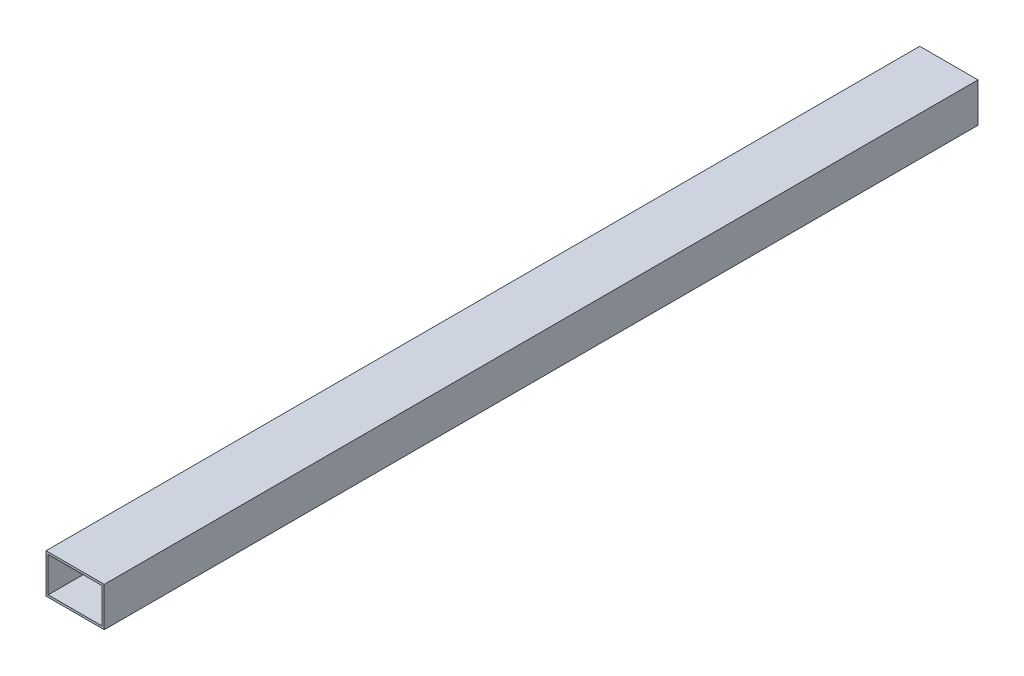
ISO-10303-21;
HEADER;
FILE_DESCRIPTION(('STEP AP214'),'2;1');
FILE_NAME('part.step','',(''),(''),'','','');
FILE_SCHEMA(('AUTOMOTIVE_DESIGN { 1 0 10303 214 1 1 1 1 }'));
ENDSEC;
DATA;
#1=APPLICATION_CONTEXT('core data for automotive mechanical design processes');
#2=APPLICATION_PROTOCOL_DEFINITION('international standard','automotive_design',2000,#1);
#3=PRODUCT_CONTEXT('',#1,'mechanical');
#4=PRODUCT('Part','Part','',(#3));
#5=PRODUCT_RELATED_PRODUCT_CATEGORY('part','',(#4));
#6=PRODUCT_DEFINITION_FORMATION('','',#4);
#7=PRODUCT_DEFINITION_CONTEXT('part definition',#1,'design');
#8=PRODUCT_DEFINITION('design','',#6,#7);
#9=PRODUCT_DEFINITION_SHAPE('','',#8);
#10=(LENGTH_UNIT() NAMED_UNIT(*) SI_UNIT(.MILLI.,.METRE.));
#11=(NAMED_UNIT(*) PLANE_ANGLE_UNIT() SI_UNIT($,.RADIAN.));
#12=(NAMED_UNIT(*) SI_UNIT($,.STERADIAN.) SOLID_ANGLE_UNIT());
#13=UNCERTAINTY_MEASURE_WITH_UNIT(LENGTH_MEASURE(1.E-05),#10,'distance_accuracy_value','');
#14=(GEOMETRIC_REPRESENTATION_CONTEXT(3) GLOBAL_UNCERTAINTY_ASSIGNED_CONTEXT((#13)) GLOBAL_UNIT_ASSIGNED_CONTEXT((#10,
#11,#12)) REPRESENTATION_CONTEXT('',''));
#15=CARTESIAN_POINT('',(0.,0.,0.));
#16=DIRECTION('',(0.,0.,1.));
#17=DIRECTION('',(1.,0.,0.));
#18=AXIS2_PLACEMENT_3D('',#15,#16,#17);
#19=CARTESIAN_POINT('',(0.,0.,600.));
#20=DIRECTION('',(0.,0.,-1.));
#21=DIRECTION('',(-1.,0.,0.));
#22=AXIS2_PLACEMENT_3D('',#19,#20,#21);
#23=PLANE('',#22);
#24=DIRECTION('',(0.,-1.,0.));
#25=VECTOR('',#24,1.);
#26=CARTESIAN_POINT('',(0.,0.,600.));
#27=LINE('',#26,#25);
#28=CARTESIAN_POINT('',(0.,27.,600.));
#29=VERTEX_POINT('',#28);
#30=CARTESIAN_POINT('',(0.,0.,600.));
#31=VERTEX_POINT('',#30);
#32=EDGE_CURVE('E134',#29,#31,#27,.T.);
#33=ORIENTED_EDGE('',*,*,#32,.T.);
#34=DIRECTION('',(1.,0.,0.));
#35=VECTOR('',#34,1.);
#36=CARTESIAN_POINT('',(0.,0.,600.));
#37=LINE('',#36,#35);
#38=CARTESIAN_POINT('',(40.,0.,600.));
#39=VERTEX_POINT('',#38);
#40=EDGE_CURVE('E137',#31,#39,#37,.T.);
#41=ORIENTED_EDGE('',*,*,#40,.T.);
#42=DIRECTION('',(0.,1.,0.));
#43=VECTOR('',#42,1.);
#44=CARTESIAN_POINT('',(40.,0.,600.));
#45=LINE('',#44,#43);
#46=CARTESIAN_POINT('',(40.,27.,600.));
#47=VERTEX_POINT('',#46);
#48=EDGE_CURVE('E140',#39,#47,#45,.T.);
#49=ORIENTED_EDGE('',*,*,#48,.T.);
#50=DIRECTION('',(-1.,0.,0.));
#51=VECTOR('',#50,1.);
#52=CARTESIAN_POINT('',(0.,27.,600.));
#53=LINE('',#52,#51);
#54=EDGE_CURVE('E142',#47,#29,#53,.T.);
#55=ORIENTED_EDGE('',*,*,#54,.T.);
#56=EDGE_LOOP('',(#33,#41,#49,#55));
#57=FACE_BOUND('',#56,.T.);
#58=DIRECTION('',(0.,-1.,0.));
#59=VECTOR('',#58,1.);
#60=CARTESIAN_POINT('',(1.5,25.5,600.));
#61=LINE('',#60,#59);
#62=CARTESIAN_POINT('',(1.5,25.5,600.));
#63=VERTEX_POINT('',#62);
#64=CARTESIAN_POINT('',(1.5,1.5,600.));
#65=VERTEX_POINT('',#64);
#66=EDGE_CURVE('E98',#63,#65,#61,.T.);
#67=ORIENTED_EDGE('',*,*,#66,.F.);
#68=DIRECTION('',(-1.,0.,0.));
#69=VECTOR('',#68,1.);
#70=CARTESIAN_POINT('',(1.5,25.5,600.));
#71=LINE('',#70,#69);
#72=CARTESIAN_POINT('',(38.5,25.5,600.));
#73=VERTEX_POINT('',#72);
#74=EDGE_CURVE('E120',#73,#63,#71,.T.);
#75=ORIENTED_EDGE('',*,*,#74,.F.);
#76=DIRECTION('',(0.,1.,0.));
#77=VECTOR('',#76,1.);
#78=CARTESIAN_POINT('',(38.5,25.5,600.));
#79=LINE('',#78,#77);
#80=CARTESIAN_POINT('',(38.5,1.5,600.));
#81=VERTEX_POINT('',#80);
#82=EDGE_CURVE('E118',#81,#73,#79,.T.);
#83=ORIENTED_EDGE('',*,*,#82,.F.);
#84=DIRECTION('',(1.,0.,0.));
#85=VECTOR('',#84,1.);
#86=CARTESIAN_POINT('',(1.5,1.5,600.));
#87=LINE('',#86,#85);
#88=EDGE_CURVE('E106',#65,#81,#87,.T.);
#89=ORIENTED_EDGE('',*,*,#88,.F.);
#90=EDGE_LOOP('',(#67,#75,#83,#89));
#91=FACE_BOUND('',#90,.T.);
#92=ADVANCED_FACE('F33',(#57,#91),#23,.F.);
#93=CARTESIAN_POINT('',(0.,0.,0.));
#94=DIRECTION('',(0.,0.,-1.));
#95=DIRECTION('',(-1.,0.,0.));
#96=AXIS2_PLACEMENT_3D('',#93,#94,#95);
#97=PLANE('',#96);
#98=DIRECTION('',(0.,-1.,0.));
#99=VECTOR('',#98,1.);
#100=CARTESIAN_POINT('',(0.,0.,0.));
#101=LINE('',#100,#99);
#102=CARTESIAN_POINT('',(0.,27.,0.));
#103=VERTEX_POINT('',#102);
#104=CARTESIAN_POINT('',(0.,0.,0.));
#105=VERTEX_POINT('',#104);
#106=EDGE_CURVE('E114',#103,#105,#101,.T.);
#107=ORIENTED_EDGE('',*,*,#106,.F.);
#108=DIRECTION('',(-1.,0.,0.));
#109=VECTOR('',#108,1.);
#110=CARTESIAN_POINT('',(0.,27.,0.));
#111=LINE('',#110,#109);
#112=CARTESIAN_POINT('',(40.,27.,0.));
#113=VERTEX_POINT('',#112);
#114=EDGE_CURVE('E138',#113,#103,#111,.T.);
#115=ORIENTED_EDGE('',*,*,#114,.F.);
#116=DIRECTION('',(0.,1.,0.));
#117=VECTOR('',#116,1.);
#118=CARTESIAN_POINT('',(40.,0.,0.));
#119=LINE('',#118,#117);
#120=CARTESIAN_POINT('',(40.,0.,0.));
#121=VERTEX_POINT('',#120);
#122=EDGE_CURVE('E149',#121,#113,#119,.T.);
#123=ORIENTED_EDGE('',*,*,#122,.F.);
#124=DIRECTION('',(1.,0.,0.));
#125=VECTOR('',#124,1.);
#126=CARTESIAN_POINT('',(0.,0.,0.));
#127=LINE('',#126,#125);
#128=EDGE_CURVE('E147',#105,#121,#127,.T.);
#129=ORIENTED_EDGE('',*,*,#128,.F.);
#130=EDGE_LOOP('',(#107,#115,#123,#129));
#131=FACE_BOUND('',#130,.T.);
#132=DIRECTION('',(-1.,0.,0.));
#133=VECTOR('',#132,1.);
#134=CARTESIAN_POINT('',(1.5,25.5,0.));
#135=LINE('',#134,#133);
#136=CARTESIAN_POINT('',(38.5,25.5,0.));
#137=VERTEX_POINT('',#136);
#138=CARTESIAN_POINT('',(1.5,25.5,0.));
#139=VERTEX_POINT('',#138);
#140=EDGE_CURVE('E107',#137,#139,#135,.T.);
#141=ORIENTED_EDGE('',*,*,#140,.T.);
#142=DIRECTION('',(0.,-1.,0.));
#143=VECTOR('',#142,1.);
#144=CARTESIAN_POINT('',(1.5,25.5,0.));
#145=LINE('',#144,#143);
#146=CARTESIAN_POINT('',(1.5,1.5,0.));
#147=VERTEX_POINT('',#146);
#148=EDGE_CURVE('E56',#139,#147,#145,.T.);
#149=ORIENTED_EDGE('',*,*,#148,.T.);
#150=DIRECTION('',(1.,0.,0.));
#151=VECTOR('',#150,1.);
#152=CARTESIAN_POINT('',(1.5,1.5,0.));
#153=LINE('',#152,#151);
#154=CARTESIAN_POINT('',(38.5,1.5,0.));
#155=VERTEX_POINT('',#154);
#156=EDGE_CURVE('E113',#147,#155,#153,.T.);
#157=ORIENTED_EDGE('',*,*,#156,.T.);
#158=DIRECTION('',(0.,1.,0.));
#159=VECTOR('',#158,1.);
#160=CARTESIAN_POINT('',(38.5,25.5,0.));
#161=LINE('',#160,#159);
#162=EDGE_CURVE('E126',#155,#137,#161,.T.);
#163=ORIENTED_EDGE('',*,*,#162,.T.);
#164=EDGE_LOOP('',(#141,#149,#157,#163));
#165=FACE_BOUND('',#164,.T.);
#166=ADVANCED_FACE('F167',(#131,#165),#97,.T.);
#167=CARTESIAN_POINT('',(0.,0.,600.));
#168=DIRECTION('',(1.,0.,0.));
#169=DIRECTION('',(0.,1.,0.));
#170=AXIS2_PLACEMENT_3D('',#167,#168,#169);
#171=PLANE('',#170);
#172=ORIENTED_EDGE('',*,*,#106,.T.);
#173=DIRECTION('',(0.,0.,-1.));
#174=VECTOR('',#173,1.);
#175=CARTESIAN_POINT('',(0.,0.,600.));
#176=LINE('',#175,#174);
#177=EDGE_CURVE('E11',#31,#105,#176,.T.);
#178=ORIENTED_EDGE('',*,*,#177,.F.);
#179=ORIENTED_EDGE('',*,*,#32,.F.);
#180=DIRECTION('',(0.,0.,-1.));
#181=VECTOR('',#180,1.);
#182=CARTESIAN_POINT('',(0.,27.,600.));
#183=LINE('',#182,#181);
#184=EDGE_CURVE('E144',#29,#103,#183,.T.);
#185=ORIENTED_EDGE('',*,*,#184,.T.);
#186=EDGE_LOOP('',(#172,#178,#179,#185));
#187=FACE_BOUND('',#186,.T.);
#188=ADVANCED_FACE('F35',(#187),#171,.F.);
#189=CARTESIAN_POINT('',(0.,0.,600.));
#190=DIRECTION('',(0.,1.,0.));
#191=DIRECTION('',(0.,0.,1.));
#192=AXIS2_PLACEMENT_3D('',#189,#190,#191);
#193=PLANE('',#192);
#194=ORIENTED_EDGE('',*,*,#128,.T.);
#195=DIRECTION('',(0.,0.,-1.));
#196=VECTOR('',#195,1.);
#197=CARTESIAN_POINT('',(40.,0.,600.));
#198=LINE('',#197,#196);
#199=EDGE_CURVE('E41',#39,#121,#198,.T.);
#200=ORIENTED_EDGE('',*,*,#199,.F.);
#201=ORIENTED_EDGE('',*,*,#40,.F.);
#202=ORIENTED_EDGE('',*,*,#177,.T.);
#203=EDGE_LOOP('',(#194,#200,#201,#202));
#204=FACE_BOUND('',#203,.T.);
#205=ADVANCED_FACE('F177',(#204),#193,.F.);
#206=CARTESIAN_POINT('',(40.,0.,600.));
#207=DIRECTION('',(-1.,0.,0.));
#208=DIRECTION('',(0.,-1.,0.));
#209=AXIS2_PLACEMENT_3D('',#206,#207,#208);
#210=PLANE('',#209);
#211=ORIENTED_EDGE('',*,*,#122,.T.);
#212=DIRECTION('',(0.,0.,-1.));
#213=VECTOR('',#212,1.);
#214=CARTESIAN_POINT('',(40.,27.,600.));
#215=LINE('',#214,#213);
#216=EDGE_CURVE('E154',#47,#113,#215,.T.);
#217=ORIENTED_EDGE('',*,*,#216,.F.);
#218=ORIENTED_EDGE('',*,*,#48,.F.);
#219=ORIENTED_EDGE('',*,*,#199,.T.);
#220=EDGE_LOOP('',(#211,#217,#218,#219));
#221=FACE_BOUND('',#220,.T.);
#222=ADVANCED_FACE('F161',(#221),#210,.F.);
#223=CARTESIAN_POINT('',(0.,27.,600.));
#224=DIRECTION('',(0.,-1.,0.));
#225=DIRECTION('',(0.,0.,-1.));
#226=AXIS2_PLACEMENT_3D('',#223,#224,#225);
#227=PLANE('',#226);
#228=ORIENTED_EDGE('',*,*,#114,.T.);
#229=ORIENTED_EDGE('',*,*,#184,.F.);
#230=ORIENTED_EDGE('',*,*,#54,.F.);
#231=ORIENTED_EDGE('',*,*,#216,.T.);
#232=EDGE_LOOP('',(#228,#229,#230,#231));
#233=FACE_BOUND('',#232,.T.);
#234=ADVANCED_FACE('F171',(#233),#227,.F.);
#235=CARTESIAN_POINT('',(1.5,25.5,600.));
#236=DIRECTION('',(1.,0.,0.));
#237=DIRECTION('',(0.,1.,0.));
#238=AXIS2_PLACEMENT_3D('',#235,#236,#237);
#239=PLANE('',#238);
#240=ORIENTED_EDGE('',*,*,#148,.F.);
#241=DIRECTION('',(0.,0.,-1.));
#242=VECTOR('',#241,1.);
#243=CARTESIAN_POINT('',(1.5,25.5,600.));
#244=LINE('',#243,#242);
#245=EDGE_CURVE('E102',#63,#139,#244,.T.);
#246=ORIENTED_EDGE('',*,*,#245,.F.);
#247=ORIENTED_EDGE('',*,*,#66,.T.);
#248=DIRECTION('',(0.,0.,-1.));
#249=VECTOR('',#248,1.);
#250=CARTESIAN_POINT('',(1.5,1.5,600.));
#251=LINE('',#250,#249);
#252=EDGE_CURVE('E101',#65,#147,#251,.T.);
#253=ORIENTED_EDGE('',*,*,#252,.T.);
#254=EDGE_LOOP('',(#240,#246,#247,#253));
#255=FACE_BOUND('',#254,.T.);
#256=ADVANCED_FACE('F100',(#255),#239,.T.);
#257=CARTESIAN_POINT('',(1.5,1.5,600.));
#258=DIRECTION('',(0.,1.,0.));
#259=DIRECTION('',(0.,0.,1.));
#260=AXIS2_PLACEMENT_3D('',#257,#258,#259);
#261=PLANE('',#260);
#262=ORIENTED_EDGE('',*,*,#156,.F.);
#263=ORIENTED_EDGE('',*,*,#252,.F.);
#264=ORIENTED_EDGE('',*,*,#88,.T.);
#265=DIRECTION('',(0.,0.,-1.));
#266=VECTOR('',#265,1.);
#267=CARTESIAN_POINT('',(38.5,1.5,600.));
#268=LINE('',#267,#266);
#269=EDGE_CURVE('E115',#81,#155,#268,.T.);
#270=ORIENTED_EDGE('',*,*,#269,.T.);
#271=EDGE_LOOP('',(#262,#263,#264,#270));
#272=FACE_BOUND('',#271,.T.);
#273=ADVANCED_FACE('F110',(#272),#261,.T.);
#274=CARTESIAN_POINT('',(38.5,25.5,600.));
#275=DIRECTION('',(-1.,0.,0.));
#276=DIRECTION('',(0.,-1.,0.));
#277=AXIS2_PLACEMENT_3D('',#274,#275,#276);
#278=PLANE('',#277);
#279=ORIENTED_EDGE('',*,*,#162,.F.);
#280=ORIENTED_EDGE('',*,*,#269,.F.);
#281=ORIENTED_EDGE('',*,*,#82,.T.);
#282=DIRECTION('',(0.,0.,-1.));
#283=VECTOR('',#282,1.);
#284=CARTESIAN_POINT('',(38.5,25.5,600.));
#285=LINE('',#284,#283);
#286=EDGE_CURVE('E48',#73,#137,#285,.T.);
#287=ORIENTED_EDGE('',*,*,#286,.T.);
#288=EDGE_LOOP('',(#279,#280,#281,#287));
#289=FACE_BOUND('',#288,.T.);
#290=ADVANCED_FACE('F200',(#289),#278,.T.);
#291=CARTESIAN_POINT('',(1.5,25.5,600.));
#292=DIRECTION('',(0.,-1.,0.));
#293=DIRECTION('',(0.,0.,-1.));
#294=AXIS2_PLACEMENT_3D('',#291,#292,#293);
#295=PLANE('',#294);
#296=ORIENTED_EDGE('',*,*,#140,.F.);
#297=ORIENTED_EDGE('',*,*,#286,.F.);
#298=ORIENTED_EDGE('',*,*,#74,.T.);
#299=ORIENTED_EDGE('',*,*,#245,.T.);
#300=EDGE_LOOP('',(#296,#297,#298,#299));
#301=FACE_BOUND('',#300,.T.);
#302=ADVANCED_FACE('F204',(#301),#295,.T.);
#303=CLOSED_SHELL('',(#92,#166,#188,#205,#222,#234,#256,#273,#290,#302));
#304=MANIFOLD_SOLID_BREP('B2',#303);
#305=ADVANCED_BREP_SHAPE_REPRESENTATION('',(#18,#304),#14);
#306=SHAPE_DEFINITION_REPRESENTATION(#9,#305);
ENDSEC;
END-ISO-10303-21;
